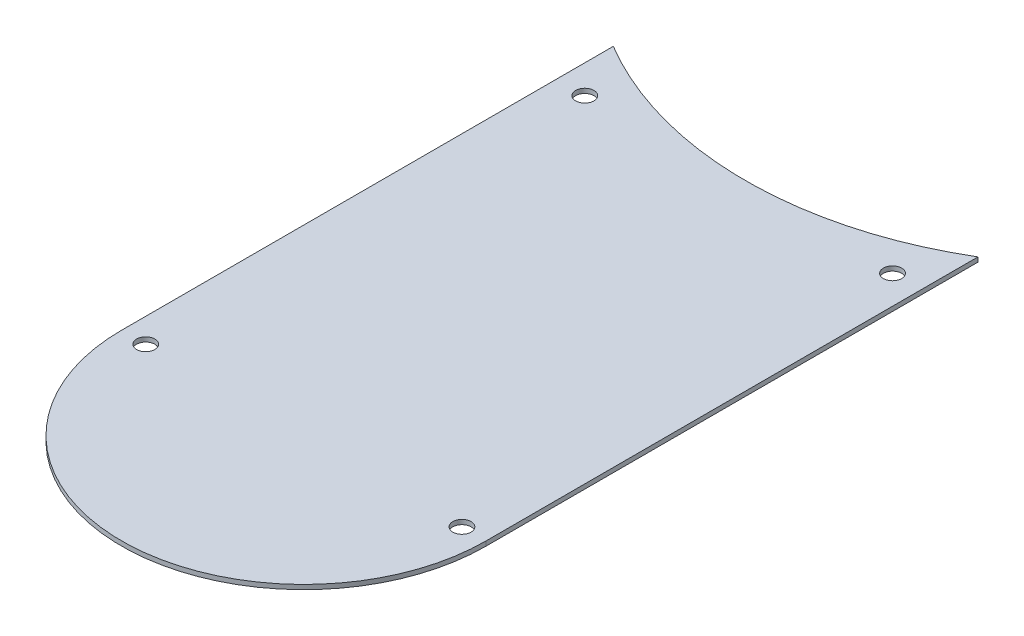
ISO-10303-21;
HEADER;
FILE_DESCRIPTION(('STEP AP214'),'2;1');
FILE_NAME('part.step','',(''),(''),'','','');
FILE_SCHEMA(('AUTOMOTIVE_DESIGN { 1 0 10303 214 1 1 1 1 }'));
ENDSEC;
DATA;
#1=APPLICATION_CONTEXT('core data for automotive mechanical design processes');
#2=APPLICATION_PROTOCOL_DEFINITION('international standard','automotive_design',2000,#1);
#3=PRODUCT_CONTEXT('',#1,'mechanical');
#4=PRODUCT('Part','Part','',(#3));
#5=PRODUCT_RELATED_PRODUCT_CATEGORY('part','',(#4));
#6=PRODUCT_DEFINITION_FORMATION('','',#4);
#7=PRODUCT_DEFINITION_CONTEXT('part definition',#1,'design');
#8=PRODUCT_DEFINITION('design','',#6,#7);
#9=PRODUCT_DEFINITION_SHAPE('','',#8);
#10=(LENGTH_UNIT() NAMED_UNIT(*) SI_UNIT(.MILLI.,.METRE.));
#11=(NAMED_UNIT(*) PLANE_ANGLE_UNIT() SI_UNIT($,.RADIAN.));
#12=(NAMED_UNIT(*) SI_UNIT($,.STERADIAN.) SOLID_ANGLE_UNIT());
#13=UNCERTAINTY_MEASURE_WITH_UNIT(LENGTH_MEASURE(1.E-05),#10,'distance_accuracy_value','');
#14=(GEOMETRIC_REPRESENTATION_CONTEXT(3) GLOBAL_UNCERTAINTY_ASSIGNED_CONTEXT((#13)) GLOBAL_UNIT_ASSIGNED_CONTEXT((#10,
#11,#12)) REPRESENTATION_CONTEXT('',''));
#15=CARTESIAN_POINT('',(0.,0.,0.));
#16=DIRECTION('',(0.,0.,1.));
#17=DIRECTION('',(1.,0.,0.));
#18=AXIS2_PLACEMENT_3D('',#15,#16,#17);
#19=CARTESIAN_POINT('',(-2.08741656162269E-12,0.8,38.0312515966505));
#20=DIRECTION('',(0.,-1.,0.));
#21=DIRECTION('',(0.,0.,-1.));
#22=AXIS2_PLACEMENT_3D('',#19,#20,#21);
#23=CYLINDRICAL_SURFACE('',#22,32.);
#24=CARTESIAN_POINT('',(-2.08741656162269E-12,0.,38.0312515966505));
#25=DIRECTION('',(0.,1.,0.));
#26=DIRECTION('',(0.,0.,1.));
#27=AXIS2_PLACEMENT_3D('',#24,#25,#26);
#28=CIRCLE('',#27,32.);
#29=CARTESIAN_POINT('',(-32.0000000000021,0.,38.0312515966504));
#30=VERTEX_POINT('',#29);
#31=CARTESIAN_POINT('',(31.9999999999979,0.,38.0312515966505));
#32=VERTEX_POINT('',#31);
#33=EDGE_CURVE('E102',#30,#32,#28,.T.);
#34=ORIENTED_EDGE('',*,*,#33,.T.);
#35=DIRECTION('',(0.,-1.,0.));
#36=VECTOR('',#35,1.);
#37=CARTESIAN_POINT('',(31.9999999999979,0.8,38.0312515966505));
#38=LINE('',#37,#36);
#39=CARTESIAN_POINT('',(31.9999999999979,0.8,38.0312515966505));
#40=VERTEX_POINT('',#39);
#41=EDGE_CURVE('E11',#40,#32,#38,.T.);
#42=ORIENTED_EDGE('',*,*,#41,.F.);
#43=CARTESIAN_POINT('',(-2.08741656162269E-12,0.8,38.0312515966505));
#44=DIRECTION('',(0.,1.,0.));
#45=DIRECTION('',(0.,0.,1.));
#46=AXIS2_PLACEMENT_3D('',#43,#44,#45);
#47=CIRCLE('',#46,32.);
#48=CARTESIAN_POINT('',(-32.0000000000021,0.8,38.0312515966504));
#49=VERTEX_POINT('',#48);
#50=EDGE_CURVE('E90',#49,#40,#47,.T.);
#51=ORIENTED_EDGE('',*,*,#50,.F.);
#52=DIRECTION('',(0.,-1.,0.));
#53=VECTOR('',#52,1.);
#54=CARTESIAN_POINT('',(-32.0000000000021,0.8,38.0312515966504));
#55=LINE('',#54,#53);
#56=EDGE_CURVE('E98',#49,#30,#55,.T.);
#57=ORIENTED_EDGE('',*,*,#56,.T.);
#58=EDGE_LOOP('',(#34,#42,#51,#57));
#59=FACE_BOUND('',#58,.T.);
#60=ADVANCED_FACE('F39',(#59),#23,.T.);
#61=CARTESIAN_POINT('',(31.9999999999979,0.8,38.0312515966505));
#62=DIRECTION('',(-1.,0.,0.));
#63=DIRECTION('',(0.,0.,1.));
#64=AXIS2_PLACEMENT_3D('',#61,#62,#63);
#65=PLANE('',#64);
#66=DIRECTION('',(0.,0.,-1.));
#67=VECTOR('',#66,1.);
#68=CARTESIAN_POINT('',(31.9999999999979,0.,38.0312515966505));
#69=LINE('',#68,#67);
#70=CARTESIAN_POINT('',(31.999999999998,0.,-48.2821578988306));
#71=VERTEX_POINT('',#70);
#72=EDGE_CURVE('E94',#32,#71,#69,.T.);
#73=ORIENTED_EDGE('',*,*,#72,.T.);
#74=DIRECTION('',(0.,-1.,0.));
#75=VECTOR('',#74,1.);
#76=CARTESIAN_POINT('',(31.999999999998,0.8,-48.2821578988306));
#77=LINE('',#76,#75);
#78=CARTESIAN_POINT('',(31.999999999998,0.8,-48.2821578988306));
#79=VERTEX_POINT('',#78);
#80=EDGE_CURVE('E47',#79,#71,#77,.T.);
#81=ORIENTED_EDGE('',*,*,#80,.F.);
#82=DIRECTION('',(0.,0.,-1.));
#83=VECTOR('',#82,1.);
#84=CARTESIAN_POINT('',(31.9999999999979,0.8,38.0312515966505));
#85=LINE('',#84,#83);
#86=EDGE_CURVE('E85',#40,#79,#85,.T.);
#87=ORIENTED_EDGE('',*,*,#86,.F.);
#88=ORIENTED_EDGE('',*,*,#41,.T.);
#89=EDGE_LOOP('',(#73,#81,#87,#88));
#90=FACE_BOUND('',#89,.T.);
#91=ADVANCED_FACE('F93',(#90),#65,.F.);
#92=CARTESIAN_POINT('',(-3.68743095678564E-12,0.8,-101.968748403349));
#93=DIRECTION('',(0.,-1.,0.));
#94=DIRECTION('',(0.,0.,-1.));
#95=AXIS2_PLACEMENT_3D('',#92,#93,#94);
#96=CYLINDRICAL_SURFACE('',#95,62.4999999999999);
#97=CARTESIAN_POINT('',(-3.68743095678564E-12,0.,-101.968748403349));
#98=DIRECTION('',(0.,-1.,0.));
#99=DIRECTION('',(0.,0.,1.));
#100=AXIS2_PLACEMENT_3D('',#97,#98,#99);
#101=CIRCLE('',#100,62.4999999999999);
#102=CARTESIAN_POINT('',(-32.0000000000021,0.,-48.2821578988286));
#103=VERTEX_POINT('',#102);
#104=EDGE_CURVE('E72',#71,#103,#101,.T.);
#105=ORIENTED_EDGE('',*,*,#104,.T.);
#106=DIRECTION('',(0.,-1.,0.));
#107=VECTOR('',#106,1.);
#108=CARTESIAN_POINT('',(-32.0000000000021,0.8,-48.2821578988286));
#109=LINE('',#108,#107);
#110=CARTESIAN_POINT('',(-32.0000000000021,0.8,-48.2821578988286));
#111=VERTEX_POINT('',#110);
#112=EDGE_CURVE('E95',#111,#103,#109,.T.);
#113=ORIENTED_EDGE('',*,*,#112,.F.);
#114=CARTESIAN_POINT('',(-3.68743095678564E-12,0.8,-101.968748403349));
#115=DIRECTION('',(0.,-1.,0.));
#116=DIRECTION('',(0.,0.,1.));
#117=AXIS2_PLACEMENT_3D('',#114,#115,#116);
#118=CIRCLE('',#117,62.4999999999999);
#119=EDGE_CURVE('E88',#79,#111,#118,.T.);
#120=ORIENTED_EDGE('',*,*,#119,.F.);
#121=ORIENTED_EDGE('',*,*,#80,.T.);
#122=EDGE_LOOP('',(#105,#113,#120,#121));
#123=FACE_BOUND('',#122,.T.);
#124=ADVANCED_FACE('F96',(#123),#96,.F.);
#125=CARTESIAN_POINT('',(-32.0000000000021,0.8,38.0312515966504));
#126=DIRECTION('',(1.,0.,0.));
#127=DIRECTION('',(0.,0.,-1.));
#128=AXIS2_PLACEMENT_3D('',#125,#126,#127);
#129=PLANE('',#128);
#130=DIRECTION('',(0.,0.,1.));
#131=VECTOR('',#130,1.);
#132=CARTESIAN_POINT('',(-32.0000000000021,0.,38.0312515966504));
#133=LINE('',#132,#131);
#134=EDGE_CURVE('E78',#103,#30,#133,.T.);
#135=ORIENTED_EDGE('',*,*,#134,.T.);
#136=ORIENTED_EDGE('',*,*,#56,.F.);
#137=DIRECTION('',(0.,0.,1.));
#138=VECTOR('',#137,1.);
#139=CARTESIAN_POINT('',(-32.0000000000021,0.8,38.0312515966504));
#140=LINE('',#139,#138);
#141=EDGE_CURVE('E55',#111,#49,#140,.T.);
#142=ORIENTED_EDGE('',*,*,#141,.F.);
#143=ORIENTED_EDGE('',*,*,#112,.T.);
#144=EDGE_LOOP('',(#135,#136,#142,#143));
#145=FACE_BOUND('',#144,.T.);
#146=ADVANCED_FACE('F110',(#145),#129,.F.);
#147=CARTESIAN_POINT('',(-2.08741656162269E-12,0.8,38.0312515966505));
#148=DIRECTION('',(0.,1.,0.));
#149=DIRECTION('',(0.,0.,1.));
#150=AXIS2_PLACEMENT_3D('',#147,#148,#149);
#151=PLANE('',#150);
#152=CARTESIAN_POINT('',(-27.7500000000036,0.8,38.0312515966504));
#153=DIRECTION('',(0.,-1.,0.));
#154=DIRECTION('',(0.,0.,-1.));
#155=AXIS2_PLACEMENT_3D('',#152,#153,#154);
#156=CIRCLE('',#155,1.60000000000009);
#157=CARTESIAN_POINT('',(-27.7500000000036,0.8,36.4312515966503));
#158=VERTEX_POINT('',#157);
#159=EDGE_CURVE('E129',#158,#158,#156,.T.);
#160=ORIENTED_EDGE('',*,*,#159,.T.);
#161=EDGE_LOOP('',(#160));
#162=FACE_BOUND('',#161,.T.);
#163=CARTESIAN_POINT('',(26.999999999998,0.8,-38.2821578988296));
#164=DIRECTION('',(0.,-1.,0.));
#165=DIRECTION('',(0.,0.,-1.));
#166=AXIS2_PLACEMENT_3D('',#163,#164,#165);
#167=CIRCLE('',#166,1.60000000000002);
#168=CARTESIAN_POINT('',(26.999999999998,0.8,-39.8821578988296));
#169=VERTEX_POINT('',#168);
#170=EDGE_CURVE('E122',#169,#169,#167,.T.);
#171=ORIENTED_EDGE('',*,*,#170,.T.);
#172=EDGE_LOOP('',(#171));
#173=FACE_BOUND('',#172,.T.);
#174=CARTESIAN_POINT('',(-27.0000000000037,0.8,-38.2821578988296));
#175=DIRECTION('',(0.,-1.,0.));
#176=DIRECTION('',(0.,0.,-1.));
#177=AXIS2_PLACEMENT_3D('',#174,#175,#176);
#178=CIRCLE('',#177,1.60000000000007);
#179=CARTESIAN_POINT('',(-27.0000000000037,0.8,-39.8821578988296));
#180=VERTEX_POINT('',#179);
#181=EDGE_CURVE('E134',#180,#180,#178,.T.);
#182=ORIENTED_EDGE('',*,*,#181,.T.);
#183=EDGE_LOOP('',(#182));
#184=FACE_BOUND('',#183,.T.);
#185=CARTESIAN_POINT('',(27.7499999999979,0.8,38.0312515966505));
#186=DIRECTION('',(0.,-1.,0.));
#187=DIRECTION('',(0.,0.,-1.));
#188=AXIS2_PLACEMENT_3D('',#185,#186,#187);
#189=CIRCLE('',#188,1.60000000000008);
#190=CARTESIAN_POINT('',(27.7499999999979,0.8,36.4312515966504));
#191=VERTEX_POINT('',#190);
#192=EDGE_CURVE('E105',#191,#191,#189,.T.);
#193=ORIENTED_EDGE('',*,*,#192,.T.);
#194=EDGE_LOOP('',(#193));
#195=FACE_BOUND('',#194,.T.);
#196=ORIENTED_EDGE('',*,*,#50,.T.);
#197=ORIENTED_EDGE('',*,*,#86,.T.);
#198=ORIENTED_EDGE('',*,*,#119,.T.);
#199=ORIENTED_EDGE('',*,*,#141,.T.);
#200=EDGE_LOOP('',(#196,#197,#198,#199));
#201=FACE_BOUND('',#200,.T.);
#202=ADVANCED_FACE('F86',(#162,#173,#184,#195,#201),#151,.T.);
#203=CARTESIAN_POINT('',(-2.08741656162269E-12,0.,38.0312515966505));
#204=DIRECTION('',(0.,1.,0.));
#205=DIRECTION('',(0.,0.,1.));
#206=AXIS2_PLACEMENT_3D('',#203,#204,#205);
#207=PLANE('',#206);
#208=CARTESIAN_POINT('',(-27.7500000000036,0.,38.0312515966504));
#209=DIRECTION('',(0.,-1.,0.));
#210=DIRECTION('',(0.,0.,-1.));
#211=AXIS2_PLACEMENT_3D('',#208,#209,#210);
#212=CIRCLE('',#211,1.60000000000009);
#213=CARTESIAN_POINT('',(-27.7500000000036,0.,36.4312515966503));
#214=VERTEX_POINT('',#213);
#215=EDGE_CURVE('E119',#214,#214,#212,.T.);
#216=ORIENTED_EDGE('',*,*,#215,.F.);
#217=EDGE_LOOP('',(#216));
#218=FACE_BOUND('',#217,.T.);
#219=CARTESIAN_POINT('',(26.999999999998,0.,-38.2821578988296));
#220=DIRECTION('',(0.,-1.,0.));
#221=DIRECTION('',(0.,0.,-1.));
#222=AXIS2_PLACEMENT_3D('',#219,#220,#221);
#223=CIRCLE('',#222,1.60000000000002);
#224=CARTESIAN_POINT('',(26.999999999998,0.,-39.8821578988296));
#225=VERTEX_POINT('',#224);
#226=EDGE_CURVE('E125',#225,#225,#223,.T.);
#227=ORIENTED_EDGE('',*,*,#226,.F.);
#228=EDGE_LOOP('',(#227));
#229=FACE_BOUND('',#228,.T.);
#230=CARTESIAN_POINT('',(-27.0000000000037,0.,-38.2821578988296));
#231=DIRECTION('',(0.,-1.,0.));
#232=DIRECTION('',(0.,0.,-1.));
#233=AXIS2_PLACEMENT_3D('',#230,#231,#232);
#234=CIRCLE('',#233,1.60000000000007);
#235=CARTESIAN_POINT('',(-27.0000000000037,0.,-39.8821578988296));
#236=VERTEX_POINT('',#235);
#237=EDGE_CURVE('E126',#236,#236,#234,.T.);
#238=ORIENTED_EDGE('',*,*,#237,.F.);
#239=EDGE_LOOP('',(#238));
#240=FACE_BOUND('',#239,.T.);
#241=CARTESIAN_POINT('',(27.7499999999979,0.,38.0312515966505));
#242=DIRECTION('',(0.,-1.,0.));
#243=DIRECTION('',(0.,0.,-1.));
#244=AXIS2_PLACEMENT_3D('',#241,#242,#243);
#245=CIRCLE('',#244,1.60000000000008);
#246=CARTESIAN_POINT('',(27.7499999999979,0.,36.4312515966504));
#247=VERTEX_POINT('',#246);
#248=EDGE_CURVE('E116',#247,#247,#245,.T.);
#249=ORIENTED_EDGE('',*,*,#248,.F.);
#250=EDGE_LOOP('',(#249));
#251=FACE_BOUND('',#250,.T.);
#252=ORIENTED_EDGE('',*,*,#33,.F.);
#253=ORIENTED_EDGE('',*,*,#134,.F.);
#254=ORIENTED_EDGE('',*,*,#104,.F.);
#255=ORIENTED_EDGE('',*,*,#72,.F.);
#256=EDGE_LOOP('',(#252,#253,#254,#255));
#257=FACE_BOUND('',#256,.T.);
#258=ADVANCED_FACE('F113',(#218,#229,#240,#251,#257),#207,.F.);
#259=CARTESIAN_POINT('',(27.7499999999979,0.8,38.0312515966505));
#260=DIRECTION('',(0.,-1.,0.));
#261=DIRECTION('',(0.,0.,-1.));
#262=AXIS2_PLACEMENT_3D('',#259,#260,#261);
#263=CYLINDRICAL_SURFACE('',#262,1.60000000000008);
#264=ORIENTED_EDGE('',*,*,#192,.F.);
#265=EDGE_LOOP('',(#264));
#266=FACE_BOUND('',#265,.T.);
#267=ORIENTED_EDGE('',*,*,#248,.T.);
#268=EDGE_LOOP('',(#267));
#269=FACE_BOUND('',#268,.T.);
#270=ADVANCED_FACE('F144',(#266,#269),#263,.F.);
#271=CARTESIAN_POINT('',(-27.0000000000037,0.8,-38.2821578988296));
#272=DIRECTION('',(0.,-1.,0.));
#273=DIRECTION('',(0.,0.,-1.));
#274=AXIS2_PLACEMENT_3D('',#271,#272,#273);
#275=CYLINDRICAL_SURFACE('',#274,1.60000000000007);
#276=ORIENTED_EDGE('',*,*,#181,.F.);
#277=EDGE_LOOP('',(#276));
#278=FACE_BOUND('',#277,.T.);
#279=ORIENTED_EDGE('',*,*,#237,.T.);
#280=EDGE_LOOP('',(#279));
#281=FACE_BOUND('',#280,.T.);
#282=ADVANCED_FACE('F140',(#278,#281),#275,.F.);
#283=CARTESIAN_POINT('',(26.999999999998,0.8,-38.2821578988296));
#284=DIRECTION('',(0.,-1.,0.));
#285=DIRECTION('',(0.,0.,-1.));
#286=AXIS2_PLACEMENT_3D('',#283,#284,#285);
#287=CYLINDRICAL_SURFACE('',#286,1.60000000000002);
#288=ORIENTED_EDGE('',*,*,#170,.F.);
#289=EDGE_LOOP('',(#288));
#290=FACE_BOUND('',#289,.T.);
#291=ORIENTED_EDGE('',*,*,#226,.T.);
#292=EDGE_LOOP('',(#291));
#293=FACE_BOUND('',#292,.T.);
#294=ADVANCED_FACE('F155',(#290,#293),#287,.F.);
#295=CARTESIAN_POINT('',(-27.7500000000036,0.8,38.0312515966504));
#296=DIRECTION('',(0.,-1.,0.));
#297=DIRECTION('',(0.,0.,-1.));
#298=AXIS2_PLACEMENT_3D('',#295,#296,#297);
#299=CYLINDRICAL_SURFACE('',#298,1.60000000000009);
#300=ORIENTED_EDGE('',*,*,#159,.F.);
#301=EDGE_LOOP('',(#300));
#302=FACE_BOUND('',#301,.T.);
#303=ORIENTED_EDGE('',*,*,#215,.T.);
#304=EDGE_LOOP('',(#303));
#305=FACE_BOUND('',#304,.T.);
#306=ADVANCED_FACE('F184',(#302,#305),#299,.F.);
#307=CLOSED_SHELL('',(#60,#91,#124,#146,#202,#258,#270,#282,#294,#306));
#308=MANIFOLD_SOLID_BREP('B2',#307);
#309=ADVANCED_BREP_SHAPE_REPRESENTATION('',(#18,#308),#14);
#310=SHAPE_DEFINITION_REPRESENTATION(#9,#309);
ENDSEC;
END-ISO-10303-21;
